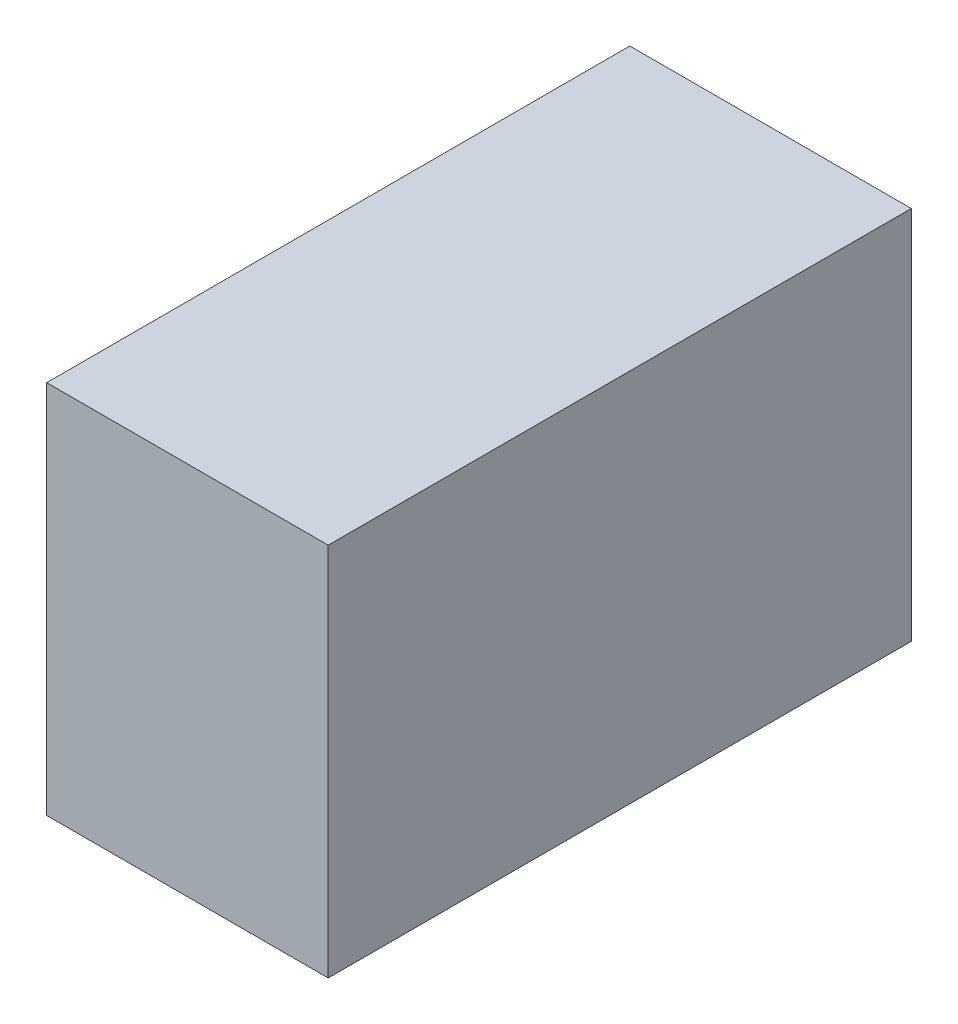
ISO-10303-21;
HEADER;
FILE_DESCRIPTION(('STEP AP214'),'2;1');
FILE_NAME('part.step','',(''),(''),'','','');
FILE_SCHEMA(('AUTOMOTIVE_DESIGN { 1 0 10303 214 1 1 1 1 }'));
ENDSEC;
DATA;
#1=APPLICATION_CONTEXT('core data for automotive mechanical design processes');
#2=APPLICATION_PROTOCOL_DEFINITION('international standard','automotive_design',2000,#1);
#3=PRODUCT_CONTEXT('',#1,'mechanical');
#4=PRODUCT('Part','Part','',(#3));
#5=PRODUCT_RELATED_PRODUCT_CATEGORY('part','',(#4));
#6=PRODUCT_DEFINITION_FORMATION('','',#4);
#7=PRODUCT_DEFINITION_CONTEXT('part definition',#1,'design');
#8=PRODUCT_DEFINITION('design','',#6,#7);
#9=PRODUCT_DEFINITION_SHAPE('','',#8);
#10=(LENGTH_UNIT() NAMED_UNIT(*) SI_UNIT(.MILLI.,.METRE.));
#11=(NAMED_UNIT(*) PLANE_ANGLE_UNIT() SI_UNIT($,.RADIAN.));
#12=(NAMED_UNIT(*) SI_UNIT($,.STERADIAN.) SOLID_ANGLE_UNIT());
#13=UNCERTAINTY_MEASURE_WITH_UNIT(LENGTH_MEASURE(1.E-05),#10,'distance_accuracy_value','');
#14=(GEOMETRIC_REPRESENTATION_CONTEXT(3) GLOBAL_UNCERTAINTY_ASSIGNED_CONTEXT((#13)) GLOBAL_UNIT_ASSIGNED_CONTEXT((#10,
#11,#12)) REPRESENTATION_CONTEXT('',''));
#15=CARTESIAN_POINT('',(0.,0.,0.));
#16=DIRECTION('',(0.,0.,1.));
#17=DIRECTION('',(1.,0.,0.));
#18=AXIS2_PLACEMENT_3D('',#15,#16,#17);
#19=CARTESIAN_POINT('',(-9.8,26.1,20.3));
#20=DIRECTION('',(0.,0.,-1.));
#21=DIRECTION('',(-1.,0.,0.));
#22=AXIS2_PLACEMENT_3D('',#19,#20,#21);
#23=PLANE('',#22);
#24=DIRECTION('',(1.,0.,0.));
#25=VECTOR('',#24,1.);
#26=CARTESIAN_POINT('',(-9.8,0.,20.3));
#27=LINE('',#26,#25);
#28=CARTESIAN_POINT('',(-9.8,0.,20.3));
#29=VERTEX_POINT('',#28);
#30=CARTESIAN_POINT('',(9.8,0.,20.3));
#31=VERTEX_POINT('',#30);
#32=EDGE_CURVE('E101',#29,#31,#27,.T.);
#33=ORIENTED_EDGE('',*,*,#32,.T.);
#34=DIRECTION('',(0.,-1.,0.));
#35=VECTOR('',#34,1.);
#36=CARTESIAN_POINT('',(9.8,26.1,20.3));
#37=LINE('',#36,#35);
#38=CARTESIAN_POINT('',(9.8,26.1,20.3));
#39=VERTEX_POINT('',#38);
#40=EDGE_CURVE('E11',#39,#31,#37,.T.);
#41=ORIENTED_EDGE('',*,*,#40,.F.);
#42=DIRECTION('',(1.,0.,0.));
#43=VECTOR('',#42,1.);
#44=CARTESIAN_POINT('',(-9.8,26.1,20.3));
#45=LINE('',#44,#43);
#46=CARTESIAN_POINT('',(-9.8,26.1,20.3));
#47=VERTEX_POINT('',#46);
#48=EDGE_CURVE('E89',#47,#39,#45,.T.);
#49=ORIENTED_EDGE('',*,*,#48,.F.);
#50=DIRECTION('',(0.,-1.,0.));
#51=VECTOR('',#50,1.);
#52=CARTESIAN_POINT('',(-9.8,26.1,20.3));
#53=LINE('',#52,#51);
#54=EDGE_CURVE('E60',#47,#29,#53,.T.);
#55=ORIENTED_EDGE('',*,*,#54,.T.);
#56=EDGE_LOOP('',(#33,#41,#49,#55));
#57=FACE_BOUND('',#56,.T.);
#58=ADVANCED_FACE('F41',(#57),#23,.F.);
#59=CARTESIAN_POINT('',(9.8,26.1,20.3));
#60=DIRECTION('',(-1.,0.,0.));
#61=DIRECTION('',(0.,0.,1.));
#62=AXIS2_PLACEMENT_3D('',#59,#60,#61);
#63=PLANE('',#62);
#64=DIRECTION('',(0.,0.,-1.));
#65=VECTOR('',#64,1.);
#66=CARTESIAN_POINT('',(9.8,0.,20.3));
#67=LINE('',#66,#65);
#68=CARTESIAN_POINT('',(9.8,0.,-20.3));
#69=VERTEX_POINT('',#68);
#70=EDGE_CURVE('E94',#31,#69,#67,.T.);
#71=ORIENTED_EDGE('',*,*,#70,.T.);
#72=DIRECTION('',(0.,-1.,0.));
#73=VECTOR('',#72,1.);
#74=CARTESIAN_POINT('',(9.8,26.1,-20.3));
#75=LINE('',#74,#73);
#76=CARTESIAN_POINT('',(9.8,26.1,-20.3));
#77=VERTEX_POINT('',#76);
#78=EDGE_CURVE('E47',#77,#69,#75,.T.);
#79=ORIENTED_EDGE('',*,*,#78,.F.);
#80=DIRECTION('',(0.,0.,-1.));
#81=VECTOR('',#80,1.);
#82=CARTESIAN_POINT('',(9.8,26.1,20.3));
#83=LINE('',#82,#81);
#84=EDGE_CURVE('E85',#39,#77,#83,.T.);
#85=ORIENTED_EDGE('',*,*,#84,.F.);
#86=ORIENTED_EDGE('',*,*,#40,.T.);
#87=EDGE_LOOP('',(#71,#79,#85,#86));
#88=FACE_BOUND('',#87,.T.);
#89=ADVANCED_FACE('F92',(#88),#63,.F.);
#90=CARTESIAN_POINT('',(-9.8,26.1,-20.3));
#91=DIRECTION('',(0.,0.,-1.));
#92=DIRECTION('',(-1.,0.,0.));
#93=AXIS2_PLACEMENT_3D('',#90,#91,#92);
#94=PLANE('',#93);
#95=DIRECTION('',(1.,0.,0.));
#96=VECTOR('',#95,1.);
#97=CARTESIAN_POINT('',(-9.8,0.,-20.3));
#98=LINE('',#97,#96);
#99=CARTESIAN_POINT('',(-9.8,0.,-20.3));
#100=VERTEX_POINT('',#99);
#101=EDGE_CURVE('E109',#100,#69,#98,.T.);
#102=ORIENTED_EDGE('',*,*,#101,.F.);
#103=DIRECTION('',(0.,-1.,0.));
#104=VECTOR('',#103,1.);
#105=CARTESIAN_POINT('',(-9.8,26.1,-20.3));
#106=LINE('',#105,#104);
#107=CARTESIAN_POINT('',(-9.8,26.1,-20.3));
#108=VERTEX_POINT('',#107);
#109=EDGE_CURVE('E72',#108,#100,#106,.T.);
#110=ORIENTED_EDGE('',*,*,#109,.F.);
#111=DIRECTION('',(1.,0.,0.));
#112=VECTOR('',#111,1.);
#113=CARTESIAN_POINT('',(-9.8,26.1,-20.3));
#114=LINE('',#113,#112);
#115=EDGE_CURVE('E87',#108,#77,#114,.T.);
#116=ORIENTED_EDGE('',*,*,#115,.T.);
#117=ORIENTED_EDGE('',*,*,#78,.T.);
#118=EDGE_LOOP('',(#102,#110,#116,#117));
#119=FACE_BOUND('',#118,.T.);
#120=ADVANCED_FACE('F97',(#119),#94,.T.);
#121=CARTESIAN_POINT('',(-9.8,26.1,20.3));
#122=DIRECTION('',(-1.,0.,0.));
#123=DIRECTION('',(0.,0.,1.));
#124=AXIS2_PLACEMENT_3D('',#121,#122,#123);
#125=PLANE('',#124);
#126=DIRECTION('',(0.,0.,-1.));
#127=VECTOR('',#126,1.);
#128=CARTESIAN_POINT('',(-9.8,0.,20.3));
#129=LINE('',#128,#127);
#130=EDGE_CURVE('E106',#29,#100,#129,.T.);
#131=ORIENTED_EDGE('',*,*,#130,.F.);
#132=ORIENTED_EDGE('',*,*,#54,.F.);
#133=DIRECTION('',(0.,0.,-1.));
#134=VECTOR('',#133,1.);
#135=CARTESIAN_POINT('',(-9.8,26.1,20.3));
#136=LINE('',#135,#134);
#137=EDGE_CURVE('E98',#47,#108,#136,.T.);
#138=ORIENTED_EDGE('',*,*,#137,.T.);
#139=ORIENTED_EDGE('',*,*,#109,.T.);
#140=EDGE_LOOP('',(#131,#132,#138,#139));
#141=FACE_BOUND('',#140,.T.);
#142=ADVANCED_FACE('F113',(#141),#125,.T.);
#143=CARTESIAN_POINT('',(0.,26.1,0.));
#144=DIRECTION('',(0.,1.,0.));
#145=DIRECTION('',(0.,0.,1.));
#146=AXIS2_PLACEMENT_3D('',#143,#144,#145);
#147=PLANE('',#146);
#148=ORIENTED_EDGE('',*,*,#48,.T.);
#149=ORIENTED_EDGE('',*,*,#84,.T.);
#150=ORIENTED_EDGE('',*,*,#115,.F.);
#151=ORIENTED_EDGE('',*,*,#137,.F.);
#152=EDGE_LOOP('',(#148,#149,#150,#151));
#153=FACE_BOUND('',#152,.T.);
#154=ADVANCED_FACE('F86',(#153),#147,.T.);
#155=CARTESIAN_POINT('',(0.,0.,0.));
#156=DIRECTION('',(0.,1.,0.));
#157=DIRECTION('',(0.,0.,1.));
#158=AXIS2_PLACEMENT_3D('',#155,#156,#157);
#159=PLANE('',#158);
#160=ORIENTED_EDGE('',*,*,#32,.F.);
#161=ORIENTED_EDGE('',*,*,#130,.T.);
#162=ORIENTED_EDGE('',*,*,#101,.T.);
#163=ORIENTED_EDGE('',*,*,#70,.F.);
#164=EDGE_LOOP('',(#160,#161,#162,#163));
#165=FACE_BOUND('',#164,.T.);
#166=ADVANCED_FACE('F114',(#165),#159,.F.);
#167=CLOSED_SHELL('',(#58,#89,#120,#142,#154,#166));
#168=MANIFOLD_SOLID_BREP('B2',#167);
#169=ADVANCED_BREP_SHAPE_REPRESENTATION('',(#18,#168),#14);
#170=SHAPE_DEFINITION_REPRESENTATION(#9,#169);
ENDSEC;
END-ISO-10303-21;
